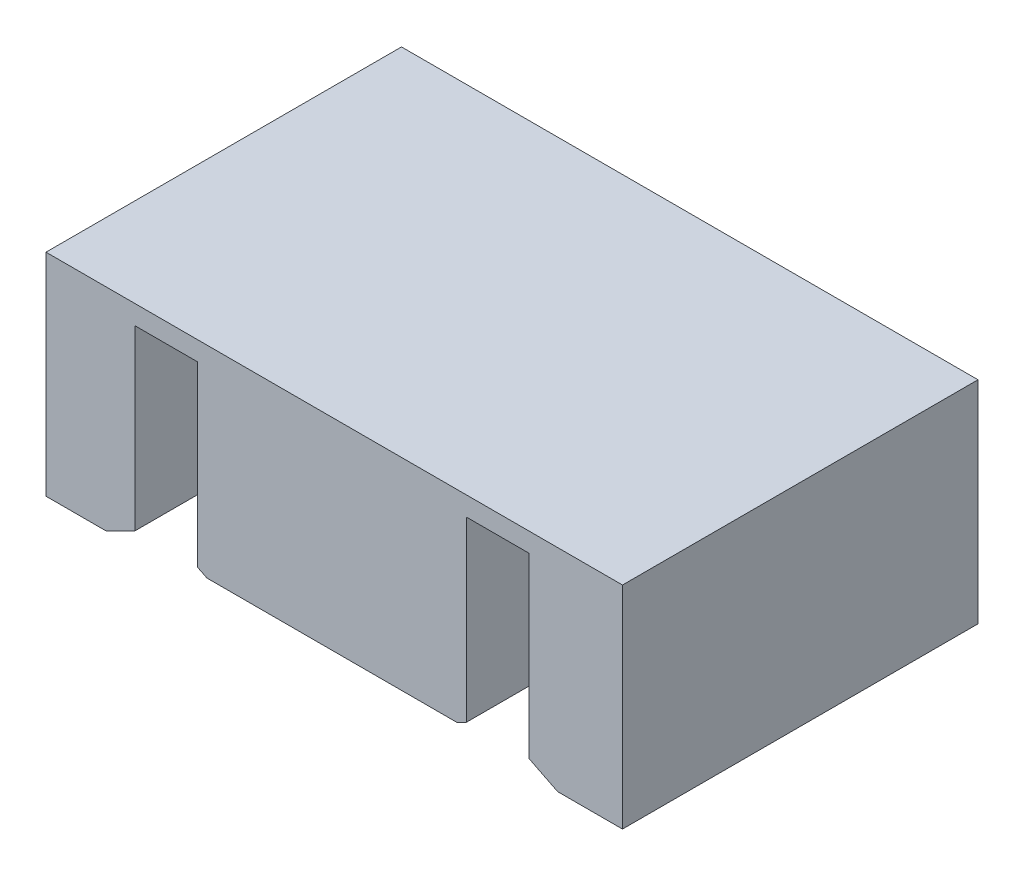
ISO-10303-21;
HEADER;
FILE_DESCRIPTION(('STEP AP214'),'2;1');
FILE_NAME('part.step','',(''),(''),'','','');
FILE_SCHEMA(('AUTOMOTIVE_DESIGN { 1 0 10303 214 1 1 1 1 }'));
ENDSEC;
DATA;
#1=APPLICATION_CONTEXT('core data for automotive mechanical design processes');
#2=APPLICATION_PROTOCOL_DEFINITION('international standard','automotive_design',2000,#1);
#3=PRODUCT_CONTEXT('',#1,'mechanical');
#4=PRODUCT('Part','Part','',(#3));
#5=PRODUCT_RELATED_PRODUCT_CATEGORY('part','',(#4));
#6=PRODUCT_DEFINITION_FORMATION('','',#4);
#7=PRODUCT_DEFINITION_CONTEXT('part definition',#1,'design');
#8=PRODUCT_DEFINITION('design','',#6,#7);
#9=PRODUCT_DEFINITION_SHAPE('','',#8);
#10=(LENGTH_UNIT() NAMED_UNIT(*) SI_UNIT(.MILLI.,.METRE.));
#11=(NAMED_UNIT(*) PLANE_ANGLE_UNIT() SI_UNIT($,.RADIAN.));
#12=(NAMED_UNIT(*) SI_UNIT($,.STERADIAN.) SOLID_ANGLE_UNIT());
#13=UNCERTAINTY_MEASURE_WITH_UNIT(LENGTH_MEASURE(1.E-05),#10,'distance_accuracy_value','');
#14=(GEOMETRIC_REPRESENTATION_CONTEXT(3) GLOBAL_UNCERTAINTY_ASSIGNED_CONTEXT((#13)) GLOBAL_UNIT_ASSIGNED_CONTEXT((#10,
#11,#12)) REPRESENTATION_CONTEXT('',''));
#15=CARTESIAN_POINT('',(0.,0.,0.));
#16=DIRECTION('',(0.,0.,1.));
#17=DIRECTION('',(1.,0.,0.));
#18=AXIS2_PLACEMENT_3D('',#15,#16,#17);
#19=CARTESIAN_POINT('',(0.,0.,0.));
#20=DIRECTION('',(0.,1.,0.));
#21=DIRECTION('',(0.,0.,1.));
#22=AXIS2_PLACEMENT_3D('',#19,#20,#21);
#23=PLANE('',#22);
#24=DIRECTION('',(1.,0.,0.));
#25=VECTOR('',#24,1.);
#26=CARTESIAN_POINT('',(-16.25,0.,-29.));
#27=LINE('',#26,#25);
#28=CARTESIAN_POINT('',(-16.25,0.,-29.));
#29=VERTEX_POINT('',#28);
#30=CARTESIAN_POINT('',(-6.74999999999997,0.,-29.));
#31=VERTEX_POINT('',#30);
#32=EDGE_CURVE('E400',#29,#31,#27,.T.);
#33=ORIENTED_EDGE('',*,*,#32,.F.);
#34=DIRECTION('',(0.,0.,1.));
#35=VECTOR('',#34,1.);
#36=CARTESIAN_POINT('',(-16.25,0.,-39.));
#37=LINE('',#36,#35);
#38=CARTESIAN_POINT('',(-16.25,0.,-35.));
#39=VERTEX_POINT('',#38);
#40=EDGE_CURVE('E304',#39,#29,#37,.T.);
#41=ORIENTED_EDGE('',*,*,#40,.F.);
#42=DIRECTION('',(-1.,0.,0.));
#43=VECTOR('',#42,1.);
#44=CARTESIAN_POINT('',(-11.5,0.,-35.));
#45=LINE('',#44,#43);
#46=CARTESIAN_POINT('',(-11.5,0.,-35.));
#47=VERTEX_POINT('',#46);
#48=EDGE_CURVE('E380',#47,#39,#45,.T.);
#49=ORIENTED_EDGE('',*,*,#48,.F.);
#50=DIRECTION('',(0.,0.,-1.));
#51=VECTOR('',#50,1.);
#52=CARTESIAN_POINT('',(-11.5,0.,-35.));
#53=LINE('',#52,#51);
#54=CARTESIAN_POINT('',(-11.5,0.,-45.));
#55=VERTEX_POINT('',#54);
#56=EDGE_CURVE('E390',#47,#55,#53,.T.);
#57=ORIENTED_EDGE('',*,*,#56,.T.);
#58=DIRECTION('',(-1.,0.,0.));
#59=VECTOR('',#58,1.);
#60=CARTESIAN_POINT('',(-60.,0.,-45.));
#61=LINE('',#60,#59);
#62=CARTESIAN_POINT('',(0.,0.,-45.));
#63=VERTEX_POINT('',#62);
#64=EDGE_CURVE('E431',#63,#55,#61,.T.);
#65=ORIENTED_EDGE('',*,*,#64,.F.);
#66=DIRECTION('',(0.,0.,-1.));
#67=VECTOR('',#66,1.);
#68=CARTESIAN_POINT('',(0.,0.,-45.));
#69=LINE('',#68,#67);
#70=CARTESIAN_POINT('',(0.,0.,-8.00000000000001));
#71=VERTEX_POINT('',#70);
#72=EDGE_CURVE('E427',#71,#63,#69,.T.);
#73=ORIENTED_EDGE('',*,*,#72,.F.);
#74=DIRECTION('',(-1.,0.,0.));
#75=VECTOR('',#74,1.);
#76=CARTESIAN_POINT('',(0.00100000000000794,0.,-8.00000000000001));
#77=LINE('',#76,#75);
#78=CARTESIAN_POINT('',(-6.74999999999997,0.,-8.00000000000001));
#79=VERTEX_POINT('',#78);
#80=EDGE_CURVE('E347',#71,#79,#77,.T.);
#81=ORIENTED_EDGE('',*,*,#80,.T.);
#82=DIRECTION('',(0.,0.,-1.));
#83=VECTOR('',#82,1.);
#84=CARTESIAN_POINT('',(-6.74999999999997,0.,0.));
#85=LINE('',#84,#83);
#86=EDGE_CURVE('E443',#79,#31,#85,.T.);
#87=ORIENTED_EDGE('',*,*,#86,.T.);
#88=EDGE_LOOP('',(#33,#41,#49,#57,#65,#73,#81,#87));
#89=FACE_BOUND('',#88,.T.);
#90=ADVANCED_FACE('F39',(#89),#23,.F.);
#91=CARTESIAN_POINT('',(-60.,30.,-45.));
#92=DIRECTION('',(1.,0.,0.));
#93=DIRECTION('',(0.,0.,-1.));
#94=AXIS2_PLACEMENT_3D('',#91,#92,#93);
#95=PLANE('',#94);
#96=DIRECTION('',(0.,0.,1.));
#97=VECTOR('',#96,1.);
#98=CARTESIAN_POINT('',(-60.,0.,-45.));
#99=LINE('',#98,#97);
#100=CARTESIAN_POINT('',(-60.,0.,-45.));
#101=VERTEX_POINT('',#100);
#102=CARTESIAN_POINT('',(-60.,0.,-8.));
#103=VERTEX_POINT('',#102);
#104=EDGE_CURVE('E419',#101,#103,#99,.T.);
#105=ORIENTED_EDGE('',*,*,#104,.T.);
#106=DIRECTION('',(0.,-1.,0.));
#107=VECTOR('',#106,1.);
#108=CARTESIAN_POINT('',(-60.,22.,-8.00000000000001));
#109=LINE('',#108,#107);
#110=CARTESIAN_POINT('',(-60.,22.,-8.00000000000001));
#111=VERTEX_POINT('',#110);
#112=EDGE_CURVE('E341',#111,#103,#109,.T.);
#113=ORIENTED_EDGE('',*,*,#112,.F.);
#114=DIRECTION('',(0.,0.,1.));
#115=VECTOR('',#114,1.);
#116=CARTESIAN_POINT('',(-60.,22.,-45.));
#117=LINE('',#116,#115);
#118=CARTESIAN_POINT('',(-60.,22.,-45.));
#119=VERTEX_POINT('',#118);
#120=EDGE_CURVE('E338',#119,#111,#117,.T.);
#121=ORIENTED_EDGE('',*,*,#120,.F.);
#122=DIRECTION('',(0.,-1.,0.));
#123=VECTOR('',#122,1.);
#124=CARTESIAN_POINT('',(-60.,30.,-45.));
#125=LINE('',#124,#123);
#126=EDGE_CURVE('E434',#119,#101,#125,.T.);
#127=ORIENTED_EDGE('',*,*,#126,.T.);
#128=EDGE_LOOP('',(#105,#113,#121,#127));
#129=FACE_BOUND('',#128,.T.);
#130=ADVANCED_FACE('F530',(#129),#95,.F.);
#131=CARTESIAN_POINT('',(0.,30.,-45.));
#132=DIRECTION('',(-1.,0.,0.));
#133=DIRECTION('',(0.,0.,1.));
#134=AXIS2_PLACEMENT_3D('',#131,#132,#133);
#135=PLANE('',#134);
#136=DIRECTION('',(0.,0.,-1.));
#137=VECTOR('',#136,1.);
#138=CARTESIAN_POINT('',(0.,22.,-45.));
#139=LINE('',#138,#137);
#140=CARTESIAN_POINT('',(0.,22.,-8.00000000000001));
#141=VERTEX_POINT('',#140);
#142=CARTESIAN_POINT('',(0.,22.,-45.));
#143=VERTEX_POINT('',#142);
#144=EDGE_CURVE('E351',#141,#143,#139,.T.);
#145=ORIENTED_EDGE('',*,*,#144,.F.);
#146=DIRECTION('',(0.,1.,0.));
#147=VECTOR('',#146,1.);
#148=CARTESIAN_POINT('',(0.,22.,-8.00000000000001));
#149=LINE('',#148,#147);
#150=EDGE_CURVE('E335',#71,#141,#149,.T.);
#151=ORIENTED_EDGE('',*,*,#150,.F.);
#152=ORIENTED_EDGE('',*,*,#72,.T.);
#153=DIRECTION('',(0.,-1.,0.));
#154=VECTOR('',#153,1.);
#155=CARTESIAN_POINT('',(0.,30.,-45.));
#156=LINE('',#155,#154);
#157=EDGE_CURVE('E436',#143,#63,#156,.T.);
#158=ORIENTED_EDGE('',*,*,#157,.F.);
#159=EDGE_LOOP('',(#145,#151,#152,#158));
#160=FACE_BOUND('',#159,.T.);
#161=ADVANCED_FACE('F522',(#160),#135,.F.);
#162=CARTESIAN_POINT('',(-60.,30.,-45.));
#163=DIRECTION('',(0.,0.,1.));
#164=DIRECTION('',(1.,0.,0.));
#165=AXIS2_PLACEMENT_3D('',#162,#163,#164);
#166=PLANE('',#165);
#167=ORIENTED_EDGE('',*,*,#126,.F.);
#168=DIRECTION('',(-1.,0.,0.));
#169=VECTOR('',#168,1.);
#170=CARTESIAN_POINT('',(0.001000000000001,22.,-45.));
#171=LINE('',#170,#169);
#172=EDGE_CURVE('E343',#143,#119,#171,.T.);
#173=ORIENTED_EDGE('',*,*,#172,.F.);
#174=ORIENTED_EDGE('',*,*,#157,.T.);
#175=ORIENTED_EDGE('',*,*,#64,.T.);
#176=CARTESIAN_POINT('',(-32.8331381050122,-5.37561332244758,-45.));
#177=DIRECTION('',(0.,0.,-1.));
#178=DIRECTION('',(-1.,0.,0.));
#179=AXIS2_PLACEMENT_3D('',#176,#177,#178);
#180=CIRCLE('',#179,22.);
#181=CARTESIAN_POINT('',(-46.230644896312,12.0745102237361,-45.));
#182=VERTEX_POINT('',#181);
#183=EDGE_CURVE('E377',#182,#55,#180,.T.);
#184=ORIENTED_EDGE('',*,*,#183,.F.);
#185=CARTESIAN_POINT('',(-44.0992233613325,9.29835420502508,-45.));
#186=DIRECTION('',(0.,0.,-1.));
#187=DIRECTION('',(-1.,0.,0.));
#188=AXIS2_PLACEMENT_3D('',#185,#186,#187);
#189=CIRCLE('',#188,3.5);
#190=CARTESIAN_POINT('',(-42.6119129602392,6.13008846951621,-45.));
#191=VERTEX_POINT('',#190);
#192=EDGE_CURVE('E395',#191,#182,#189,.T.);
#193=ORIENTED_EDGE('',*,*,#192,.F.);
#194=CARTESIAN_POINT('',(-38.183580329191,-3.30313712352215,-45.));
#195=DIRECTION('',(0.,0.,1.));
#196=DIRECTION('',(1.,0.,0.));
#197=AXIS2_PLACEMENT_3D('',#194,#195,#196);
#198=CIRCLE('',#197,10.4209344581165);
#199=CARTESIAN_POINT('',(-28.3,0.,-45.));
#200=VERTEX_POINT('',#199);
#201=EDGE_CURVE('E392',#200,#191,#198,.T.);
#202=ORIENTED_EDGE('',*,*,#201,.F.);
#203=EDGE_CURVE('E430',#200,#101,#61,.T.);
#204=ORIENTED_EDGE('',*,*,#203,.T.);
#205=EDGE_LOOP('',(#167,#173,#174,#175,#184,#193,#202,#204));
#206=FACE_BOUND('',#205,.T.);
#207=ADVANCED_FACE('F588',(#206),#166,.F.);
#208=DIRECTION('',(1.,0.,0.));
#209=VECTOR('',#208,1.);
#210=CARTESIAN_POINT('',(-44.25,0.,-39.));
#211=LINE('',#210,#209);
#212=CARTESIAN_POINT('',(-44.25,0.,-39.));
#213=VERTEX_POINT('',#212);
#214=CARTESIAN_POINT('',(-28.3,0.,-39.));
#215=VERTEX_POINT('',#214);
#216=EDGE_CURVE('E312',#213,#215,#211,.T.);
#217=ORIENTED_EDGE('',*,*,#216,.F.);
#218=DIRECTION('',(0.,0.,-1.));
#219=VECTOR('',#218,1.);
#220=CARTESIAN_POINT('',(-44.25,0.,-39.));
#221=LINE('',#220,#219);
#222=CARTESIAN_POINT('',(-44.25,0.,-29.));
#223=VERTEX_POINT('',#222);
#224=EDGE_CURVE('E283',#223,#213,#221,.T.);
#225=ORIENTED_EDGE('',*,*,#224,.F.);
#226=DIRECTION('',(1.,0.,0.));
#227=VECTOR('',#226,1.);
#228=CARTESIAN_POINT('',(-50.75,0.,-29.));
#229=LINE('',#228,#227);
#230=CARTESIAN_POINT('',(-53.75,0.,-29.));
#231=VERTEX_POINT('',#230);
#232=EDGE_CURVE('E410',#231,#223,#229,.T.);
#233=ORIENTED_EDGE('',*,*,#232,.F.);
#234=DIRECTION('',(0.,0.,1.));
#235=VECTOR('',#234,1.);
#236=CARTESIAN_POINT('',(-53.75,0.,0.));
#237=LINE('',#236,#235);
#238=CARTESIAN_POINT('',(-53.75,0.,-8.));
#239=VERTEX_POINT('',#238);
#240=EDGE_CURVE('E440',#231,#239,#237,.T.);
#241=ORIENTED_EDGE('',*,*,#240,.T.);
#242=EDGE_CURVE('E344',#239,#103,#77,.T.);
#243=ORIENTED_EDGE('',*,*,#242,.T.);
#244=ORIENTED_EDGE('',*,*,#104,.F.);
#245=ORIENTED_EDGE('',*,*,#203,.F.);
#246=DIRECTION('',(0.,0.,-1.));
#247=VECTOR('',#246,1.);
#248=CARTESIAN_POINT('',(-28.3,0.,-35.));
#249=LINE('',#248,#247);
#250=EDGE_CURVE('E403',#215,#200,#249,.T.);
#251=ORIENTED_EDGE('',*,*,#250,.F.);
#252=EDGE_LOOP('',(#217,#225,#233,#241,#243,#244,#245,#251));
#253=FACE_BOUND('',#252,.T.);
#254=ADVANCED_FACE('F536',(#253),#23,.F.);
#255=CARTESIAN_POINT('',(-16.25,20.,-7.));
#256=DIRECTION('',(-1.,0.,0.));
#257=DIRECTION('',(0.,0.,1.));
#258=AXIS2_PLACEMENT_3D('',#255,#256,#257);
#259=PLANE('',#258);
#260=DIRECTION('',(0.,0.,-1.));
#261=VECTOR('',#260,1.);
#262=CARTESIAN_POINT('',(-16.25,20.,-7.));
#263=LINE('',#262,#261);
#264=CARTESIAN_POINT('',(-16.25,20.,-8.00000000000001));
#265=VERTEX_POINT('',#264);
#266=CARTESIAN_POINT('',(-16.25,20.,-35.));
#267=VERTEX_POINT('',#266);
#268=EDGE_CURVE('E259',#265,#267,#263,.T.);
#269=ORIENTED_EDGE('',*,*,#268,.F.);
#270=DIRECTION('',(0.,1.,0.));
#271=VECTOR('',#270,1.);
#272=CARTESIAN_POINT('',(-16.25,22.,-8.00000000000001));
#273=LINE('',#272,#271);
#274=CARTESIAN_POINT('',(-16.25,1.50000000000001,-8.00000000000001));
#275=VERTEX_POINT('',#274);
#276=EDGE_CURVE('E372',#275,#265,#273,.T.);
#277=ORIENTED_EDGE('',*,*,#276,.F.);
#278=DIRECTION('',(0.,0.,-1.));
#279=VECTOR('',#278,1.);
#280=CARTESIAN_POINT('',(-16.25,1.50000000000001,-7.));
#281=LINE('',#280,#279);
#282=CARTESIAN_POINT('',(-16.25,1.50000000000001,-29.));
#283=VERTEX_POINT('',#282);
#284=EDGE_CURVE('E446',#275,#283,#281,.T.);
#285=ORIENTED_EDGE('',*,*,#284,.T.);
#286=DIRECTION('',(0.,-1.,0.));
#287=VECTOR('',#286,1.);
#288=CARTESIAN_POINT('',(-16.25,20.,-29.));
#289=LINE('',#288,#287);
#290=CARTESIAN_POINT('',(-16.25,10.,-29.));
#291=VERTEX_POINT('',#290);
#292=EDGE_CURVE('E258',#291,#283,#289,.T.);
#293=ORIENTED_EDGE('',*,*,#292,.F.);
#294=DIRECTION('',(0.,-0.707106781186549,0.707106781186546));
#295=VECTOR('',#294,1.);
#296=CARTESIAN_POINT('',(-16.25,4.00000000000002,-23.));
#297=LINE('',#296,#295);
#298=CARTESIAN_POINT('',(-16.25,12.,-31.));
#299=VERTEX_POINT('',#298);
#300=EDGE_CURVE('E491',#291,#299,#297,.F.);
#301=ORIENTED_EDGE('',*,*,#300,.T.);
#302=DIRECTION('',(0.,0.,1.));
#303=VECTOR('',#302,1.);
#304=CARTESIAN_POINT('',(-16.25,12.,-35.));
#305=LINE('',#304,#303);
#306=CARTESIAN_POINT('',(-16.25,12.,-35.));
#307=VERTEX_POINT('',#306);
#308=EDGE_CURVE('E280',#307,#299,#305,.T.);
#309=ORIENTED_EDGE('',*,*,#308,.F.);
#310=DIRECTION('',(0.,-1.,0.));
#311=VECTOR('',#310,1.);
#312=CARTESIAN_POINT('',(-16.25,20.,-35.));
#313=LINE('',#312,#311);
#314=EDGE_CURVE('E268',#267,#307,#313,.T.);
#315=ORIENTED_EDGE('',*,*,#314,.F.);
#316=EDGE_LOOP('',(#269,#277,#285,#293,#301,#309,#315));
#317=FACE_BOUND('',#316,.T.);
#318=ADVANCED_FACE('F495',(#317),#259,.F.);
#319=CARTESIAN_POINT('',(-9.75,20.,-7.));
#320=DIRECTION('',(1.,0.,0.));
#321=DIRECTION('',(0.,0.,-1.));
#322=AXIS2_PLACEMENT_3D('',#319,#320,#321);
#323=PLANE('',#322);
#324=DIRECTION('',(0.,0.,1.));
#325=VECTOR('',#324,1.);
#326=CARTESIAN_POINT('',(-9.75,1.50000000000001,-7.));
#327=LINE('',#326,#325);
#328=CARTESIAN_POINT('',(-9.75,1.50000000000001,-29.));
#329=VERTEX_POINT('',#328);
#330=CARTESIAN_POINT('',(-9.75,1.50000000000001,-8.00000000000001));
#331=VERTEX_POINT('',#330);
#332=EDGE_CURVE('E438',#329,#331,#327,.T.);
#333=ORIENTED_EDGE('',*,*,#332,.T.);
#334=DIRECTION('',(0.,-1.,0.));
#335=VECTOR('',#334,1.);
#336=CARTESIAN_POINT('',(-9.75,22.,-8.00000000000001));
#337=LINE('',#336,#335);
#338=CARTESIAN_POINT('',(-9.75,20.,-8.00000000000001));
#339=VERTEX_POINT('',#338);
#340=EDGE_CURVE('E255',#339,#331,#337,.T.);
#341=ORIENTED_EDGE('',*,*,#340,.F.);
#342=DIRECTION('',(0.,0.,1.));
#343=VECTOR('',#342,1.);
#344=CARTESIAN_POINT('',(-9.75,20.,-7.));
#345=LINE('',#344,#343);
#346=CARTESIAN_POINT('',(-9.75,20.,-35.));
#347=VERTEX_POINT('',#346);
#348=EDGE_CURVE('E247',#347,#339,#345,.T.);
#349=ORIENTED_EDGE('',*,*,#348,.F.);
#350=DIRECTION('',(0.,1.,0.));
#351=VECTOR('',#350,1.);
#352=CARTESIAN_POINT('',(-9.75,20.,-35.));
#353=LINE('',#352,#351);
#354=CARTESIAN_POINT('',(-9.75,12.,-35.));
#355=VERTEX_POINT('',#354);
#356=EDGE_CURVE('E253',#355,#347,#353,.T.);
#357=ORIENTED_EDGE('',*,*,#356,.F.);
#358=DIRECTION('',(0.,0.,1.));
#359=VECTOR('',#358,1.);
#360=CARTESIAN_POINT('',(-9.75,12.,-35.));
#361=LINE('',#360,#359);
#362=CARTESIAN_POINT('',(-9.75,12.,-31.));
#363=VERTEX_POINT('',#362);
#364=EDGE_CURVE('E281',#355,#363,#361,.T.);
#365=ORIENTED_EDGE('',*,*,#364,.T.);
#366=DIRECTION('',(0.,0.707106781186549,-0.707106781186546));
#367=VECTOR('',#366,1.);
#368=CARTESIAN_POINT('',(-9.75,4.00000000000002,-23.));
#369=LINE('',#368,#367);
#370=CARTESIAN_POINT('',(-9.75,10.,-29.));
#371=VERTEX_POINT('',#370);
#372=EDGE_CURVE('E489',#363,#371,#369,.F.);
#373=ORIENTED_EDGE('',*,*,#372,.T.);
#374=DIRECTION('',(0.,-1.,0.));
#375=VECTOR('',#374,1.);
#376=CARTESIAN_POINT('',(-9.75,20.,-29.));
#377=LINE('',#376,#375);
#378=EDGE_CURVE('E416',#371,#329,#377,.T.);
#379=ORIENTED_EDGE('',*,*,#378,.T.);
#380=EDGE_LOOP('',(#333,#341,#349,#357,#365,#373,#379));
#381=FACE_BOUND('',#380,.T.);
#382=ADVANCED_FACE('F250',(#381),#323,.F.);
#383=CARTESIAN_POINT('',(-16.25,20.,-29.));
#384=DIRECTION('',(0.,0.,-1.));
#385=DIRECTION('',(-1.,0.,0.));
#386=AXIS2_PLACEMENT_3D('',#383,#384,#385);
#387=PLANE('',#386);
#388=ORIENTED_EDGE('',*,*,#378,.F.);
#389=DIRECTION('',(-1.,0.,0.));
#390=VECTOR('',#389,1.);
#391=CARTESIAN_POINT('',(-16.25,10.,-29.));
#392=LINE('',#391,#390);
#393=EDGE_CURVE('E483',#371,#291,#392,.T.);
#394=ORIENTED_EDGE('',*,*,#393,.T.);
#395=ORIENTED_EDGE('',*,*,#292,.T.);
#396=DIRECTION('',(0.894427190999917,0.447213595499956,0.));
#397=VECTOR('',#396,1.);
#398=CARTESIAN_POINT('',(-8.85000000000002,5.19999999999998,-29.));
#399=LINE('',#398,#397);
#400=CARTESIAN_POINT('',(-17.25,1.,-29.));
#401=VERTEX_POINT('',#400);
#402=EDGE_CURVE('E458',#283,#401,#399,.F.);
#403=ORIENTED_EDGE('',*,*,#402,.T.);
#404=DIRECTION('',(1.,0.,0.));
#405=VECTOR('',#404,1.);
#406=CARTESIAN_POINT('',(-16.25,1.,-29.));
#407=LINE('',#406,#405);
#408=CARTESIAN_POINT('',(-16.25,1.,-29.));
#409=VERTEX_POINT('',#408);
#410=EDGE_CURVE('E324',#401,#409,#407,.T.);
#411=ORIENTED_EDGE('',*,*,#410,.T.);
#412=DIRECTION('',(0.,-1.,0.));
#413=VECTOR('',#412,1.);
#414=CARTESIAN_POINT('',(-16.25,20.,-29.));
#415=LINE('',#414,#413);
#416=EDGE_CURVE('E332',#409,#29,#415,.T.);
#417=ORIENTED_EDGE('',*,*,#416,.T.);
#418=ORIENTED_EDGE('',*,*,#32,.T.);
#419=DIRECTION('',(0.894427190999917,-0.447213595499956,0.));
#420=VECTOR('',#419,1.);
#421=CARTESIAN_POINT('',(-22.35,7.79999999999997,-29.));
#422=LINE('',#421,#420);
#423=EDGE_CURVE('E455',#31,#329,#422,.F.);
#424=ORIENTED_EDGE('',*,*,#423,.T.);
#425=EDGE_LOOP('',(#388,#394,#395,#403,#411,#417,#418,#424));
#426=FACE_BOUND('',#425,.T.);
#427=ADVANCED_FACE('F504',(#426),#387,.F.);
#428=CARTESIAN_POINT('',(0.,20.,0.));
#429=DIRECTION('',(0.,-1.,0.));
#430=DIRECTION('',(0.,0.,-1.));
#431=AXIS2_PLACEMENT_3D('',#428,#429,#430);
#432=PLANE('',#431);
#433=DIRECTION('',(-1.,0.,0.));
#434=VECTOR('',#433,1.);
#435=CARTESIAN_POINT('',(0.00100000000000794,20.,-8.00000000000001));
#436=LINE('',#435,#434);
#437=EDGE_CURVE('E370',#339,#265,#436,.T.);
#438=ORIENTED_EDGE('',*,*,#437,.T.);
#439=ORIENTED_EDGE('',*,*,#268,.T.);
#440=DIRECTION('',(-1.,0.,0.));
#441=VECTOR('',#440,1.);
#442=CARTESIAN_POINT('',(-9.75,20.,-35.));
#443=LINE('',#442,#441);
#444=EDGE_CURVE('E262',#347,#267,#443,.T.);
#445=ORIENTED_EDGE('',*,*,#444,.F.);
#446=ORIENTED_EDGE('',*,*,#348,.T.);
#447=EDGE_LOOP('',(#438,#439,#445,#446));
#448=FACE_BOUND('',#447,.T.);
#449=ADVANCED_FACE('F263',(#448),#432,.T.);
#450=CARTESIAN_POINT('',(-50.75,20.,-7.));
#451=DIRECTION('',(-1.,0.,0.));
#452=DIRECTION('',(0.,0.,1.));
#453=AXIS2_PLACEMENT_3D('',#450,#451,#452);
#454=PLANE('',#453);
#455=DIRECTION('',(0.,0.,-1.));
#456=VECTOR('',#455,1.);
#457=CARTESIAN_POINT('',(-50.75,20.,-7.));
#458=LINE('',#457,#456);
#459=CARTESIAN_POINT('',(-50.75,20.,-8.00000000000001));
#460=VERTEX_POINT('',#459);
#461=CARTESIAN_POINT('',(-50.75,20.,-35.));
#462=VERTEX_POINT('',#461);
#463=EDGE_CURVE('E407',#460,#462,#458,.T.);
#464=ORIENTED_EDGE('',*,*,#463,.F.);
#465=DIRECTION('',(0.,1.,0.));
#466=VECTOR('',#465,1.);
#467=CARTESIAN_POINT('',(-50.75,22.,-8.00000000000001));
#468=LINE('',#467,#466);
#469=CARTESIAN_POINT('',(-50.75,1.50000000000001,-8.));
#470=VERTEX_POINT('',#469);
#471=EDGE_CURVE('E356',#470,#460,#468,.T.);
#472=ORIENTED_EDGE('',*,*,#471,.F.);
#473=DIRECTION('',(0.,0.,-1.));
#474=VECTOR('',#473,1.);
#475=CARTESIAN_POINT('',(-50.75,1.50000000000001,-7.));
#476=LINE('',#475,#474);
#477=CARTESIAN_POINT('',(-50.75,1.50000000000001,-29.));
#478=VERTEX_POINT('',#477);
#479=EDGE_CURVE('E449',#470,#478,#476,.T.);
#480=ORIENTED_EDGE('',*,*,#479,.T.);
#481=DIRECTION('',(0.,-1.,0.));
#482=VECTOR('',#481,1.);
#483=CARTESIAN_POINT('',(-50.75,20.,-29.));
#484=LINE('',#483,#482);
#485=CARTESIAN_POINT('',(-50.75,9.99999999999999,-29.));
#486=VERTEX_POINT('',#485);
#487=EDGE_CURVE('E413',#486,#478,#484,.T.);
#488=ORIENTED_EDGE('',*,*,#487,.F.);
#489=DIRECTION('',(0.,-0.707106781186549,0.707106781186546));
#490=VECTOR('',#489,1.);
#491=CARTESIAN_POINT('',(-50.75,4.00000000000001,-23.0000000000001));
#492=LINE('',#491,#490);
#493=CARTESIAN_POINT('',(-50.75,12.,-31.));
#494=VERTEX_POINT('',#493);
#495=EDGE_CURVE('E11',#486,#494,#492,.F.);
#496=ORIENTED_EDGE('',*,*,#495,.T.);
#497=DIRECTION('',(0.,0.,1.));
#498=VECTOR('',#497,1.);
#499=CARTESIAN_POINT('',(-50.75,12.,-35.));
#500=LINE('',#499,#498);
#501=CARTESIAN_POINT('',(-50.75,12.,-35.));
#502=VERTEX_POINT('',#501);
#503=EDGE_CURVE('E275',#502,#494,#500,.T.);
#504=ORIENTED_EDGE('',*,*,#503,.F.);
#505=DIRECTION('',(0.,-1.,0.));
#506=VECTOR('',#505,1.);
#507=CARTESIAN_POINT('',(-50.75,20.,-35.));
#508=LINE('',#507,#506);
#509=EDGE_CURVE('E293',#462,#502,#508,.T.);
#510=ORIENTED_EDGE('',*,*,#509,.F.);
#511=EDGE_LOOP('',(#464,#472,#480,#488,#496,#504,#510));
#512=FACE_BOUND('',#511,.T.);
#513=ADVANCED_FACE('F546',(#512),#454,.F.);
#514=CARTESIAN_POINT('',(-44.25,20.,-7.));
#515=DIRECTION('',(1.,0.,0.));
#516=DIRECTION('',(0.,0.,-1.));
#517=AXIS2_PLACEMENT_3D('',#514,#515,#516);
#518=PLANE('',#517);
#519=DIRECTION('',(0.,0.,1.));
#520=VECTOR('',#519,1.);
#521=CARTESIAN_POINT('',(-44.25,1.50000000000001,-7.));
#522=LINE('',#521,#520);
#523=CARTESIAN_POINT('',(-44.25,1.50000000000001,-29.));
#524=VERTEX_POINT('',#523);
#525=CARTESIAN_POINT('',(-44.25,1.50000000000001,-8.));
#526=VERTEX_POINT('',#525);
#527=EDGE_CURVE('E452',#524,#526,#522,.T.);
#528=ORIENTED_EDGE('',*,*,#527,.T.);
#529=DIRECTION('',(0.,-1.,0.));
#530=VECTOR('',#529,1.);
#531=CARTESIAN_POINT('',(-44.25,22.,-8.00000000000001));
#532=LINE('',#531,#530);
#533=CARTESIAN_POINT('',(-44.25,20.,-8.00000000000001));
#534=VERTEX_POINT('',#533);
#535=EDGE_CURVE('E361',#534,#526,#532,.T.);
#536=ORIENTED_EDGE('',*,*,#535,.F.);
#537=DIRECTION('',(0.,0.,1.));
#538=VECTOR('',#537,1.);
#539=CARTESIAN_POINT('',(-44.25,20.,-7.));
#540=LINE('',#539,#538);
#541=CARTESIAN_POINT('',(-44.25,20.,-35.));
#542=VERTEX_POINT('',#541);
#543=EDGE_CURVE('E409',#542,#534,#540,.T.);
#544=ORIENTED_EDGE('',*,*,#543,.F.);
#545=DIRECTION('',(0.,1.,0.));
#546=VECTOR('',#545,1.);
#547=CARTESIAN_POINT('',(-44.25,20.,-35.));
#548=LINE('',#547,#546);
#549=CARTESIAN_POINT('',(-44.25,13.430110924993,-35.));
#550=VERTEX_POINT('',#549);
#551=EDGE_CURVE('E290',#550,#542,#548,.T.);
#552=ORIENTED_EDGE('',*,*,#551,.F.);
#553=CARTESIAN_POINT('',(-44.25,12.,-35.));
#554=VERTEX_POINT('',#553);
#555=EDGE_CURVE('E286',#554,#550,#548,.T.);
#556=ORIENTED_EDGE('',*,*,#555,.F.);
#557=DIRECTION('',(0.,0.,1.));
#558=VECTOR('',#557,1.);
#559=CARTESIAN_POINT('',(-44.25,12.,-35.));
#560=LINE('',#559,#558);
#561=CARTESIAN_POINT('',(-44.25,12.,-31.));
#562=VERTEX_POINT('',#561);
#563=EDGE_CURVE('E273',#554,#562,#560,.T.);
#564=ORIENTED_EDGE('',*,*,#563,.T.);
#565=DIRECTION('',(0.,0.707106781186549,-0.707106781186546));
#566=VECTOR('',#565,1.);
#567=CARTESIAN_POINT('',(-44.25,4.00000000000001,-23.0000000000001));
#568=LINE('',#567,#566);
#569=CARTESIAN_POINT('',(-44.25,9.99999999999999,-29.));
#570=VERTEX_POINT('',#569);
#571=EDGE_CURVE('E47',#562,#570,#568,.F.);
#572=ORIENTED_EDGE('',*,*,#571,.T.);
#573=DIRECTION('',(0.,-1.,0.));
#574=VECTOR('',#573,1.);
#575=CARTESIAN_POINT('',(-44.25,20.,-29.));
#576=LINE('',#575,#574);
#577=EDGE_CURVE('E417',#570,#524,#576,.T.);
#578=ORIENTED_EDGE('',*,*,#577,.T.);
#579=EDGE_LOOP('',(#528,#536,#544,#552,#556,#564,#572,#578));
#580=FACE_BOUND('',#579,.T.);
#581=ADVANCED_FACE('F555',(#580),#518,.F.);
#582=CARTESIAN_POINT('',(-50.75,20.,-29.));
#583=DIRECTION('',(0.,0.,-1.));
#584=DIRECTION('',(-1.,0.,0.));
#585=AXIS2_PLACEMENT_3D('',#582,#583,#584);
#586=PLANE('',#585);
#587=ORIENTED_EDGE('',*,*,#577,.F.);
#588=DIRECTION('',(-1.,0.,0.));
#589=VECTOR('',#588,1.);
#590=CARTESIAN_POINT('',(-50.75,9.99999999999999,-29.));
#591=LINE('',#590,#589);
#592=EDGE_CURVE('E54',#570,#486,#591,.T.);
#593=ORIENTED_EDGE('',*,*,#592,.T.);
#594=ORIENTED_EDGE('',*,*,#487,.T.);
#595=DIRECTION('',(0.894427190999917,0.447213595499956,0.));
#596=VECTOR('',#595,1.);
#597=CARTESIAN_POINT('',(-43.35,5.19999999999998,-29.));
#598=LINE('',#597,#596);
#599=EDGE_CURVE('E461',#478,#231,#598,.F.);
#600=ORIENTED_EDGE('',*,*,#599,.T.);
#601=ORIENTED_EDGE('',*,*,#232,.T.);
#602=DIRECTION('',(0.,1.,0.));
#603=VECTOR('',#602,1.);
#604=CARTESIAN_POINT('',(-44.25,20.,-29.));
#605=LINE('',#604,#603);
#606=CARTESIAN_POINT('',(-44.25,1.,-29.));
#607=VERTEX_POINT('',#606);
#608=EDGE_CURVE('E475',#223,#607,#605,.T.);
#609=ORIENTED_EDGE('',*,*,#608,.T.);
#610=DIRECTION('',(1.,0.,0.));
#611=VECTOR('',#610,1.);
#612=CARTESIAN_POINT('',(-50.75,1.,-29.));
#613=LINE('',#612,#611);
#614=CARTESIAN_POINT('',(-43.25,1.,-29.));
#615=VERTEX_POINT('',#614);
#616=EDGE_CURVE('E319',#607,#615,#613,.T.);
#617=ORIENTED_EDGE('',*,*,#616,.T.);
#618=DIRECTION('',(0.894427190999917,-0.447213595499956,0.));
#619=VECTOR('',#618,1.);
#620=CARTESIAN_POINT('',(-56.85,7.79999999999997,-29.));
#621=LINE('',#620,#619);
#622=EDGE_CURVE('E464',#615,#524,#621,.F.);
#623=ORIENTED_EDGE('',*,*,#622,.T.);
#624=EDGE_LOOP('',(#587,#593,#594,#600,#601,#609,#617,#623));
#625=FACE_BOUND('',#624,.T.);
#626=ADVANCED_FACE('F606',(#625),#586,.F.);
#627=CARTESIAN_POINT('',(0.,20.,0.));
#628=DIRECTION('',(0.,-1.,0.));
#629=DIRECTION('',(0.,0.,-1.));
#630=AXIS2_PLACEMENT_3D('',#627,#628,#629);
#631=PLANE('',#630);
#632=DIRECTION('',(-1.,0.,0.));
#633=VECTOR('',#632,1.);
#634=CARTESIAN_POINT('',(0.00100000000000794,20.,-8.00000000000001));
#635=LINE('',#634,#633);
#636=EDGE_CURVE('E358',#534,#460,#635,.T.);
#637=ORIENTED_EDGE('',*,*,#636,.T.);
#638=ORIENTED_EDGE('',*,*,#463,.T.);
#639=DIRECTION('',(-1.,0.,0.));
#640=VECTOR('',#639,1.);
#641=CARTESIAN_POINT('',(-44.25,20.,-35.));
#642=LINE('',#641,#640);
#643=EDGE_CURVE('E289',#542,#462,#642,.T.);
#644=ORIENTED_EDGE('',*,*,#643,.F.);
#645=ORIENTED_EDGE('',*,*,#543,.T.);
#646=EDGE_LOOP('',(#637,#638,#644,#645));
#647=FACE_BOUND('',#646,.T.);
#648=ADVANCED_FACE('F551',(#647),#631,.T.);
#649=CARTESIAN_POINT('',(-32.8331381050122,-5.37561332244758,-35.));
#650=DIRECTION('',(0.,0.,-1.));
#651=DIRECTION('',(-1.,0.,0.));
#652=AXIS2_PLACEMENT_3D('',#649,#650,#651);
#653=CYLINDRICAL_SURFACE('',#652,22.);
#654=ORIENTED_EDGE('',*,*,#183,.T.);
#655=ORIENTED_EDGE('',*,*,#56,.F.);
#656=CARTESIAN_POINT('',(-32.8331381050122,-5.37561332244758,-35.));
#657=DIRECTION('',(0.,0.,-1.));
#658=DIRECTION('',(-1.,0.,0.));
#659=AXIS2_PLACEMENT_3D('',#656,#657,#658);
#660=CIRCLE('',#659,22.);
#661=EDGE_CURVE('E381',#550,#47,#660,.T.);
#662=ORIENTED_EDGE('',*,*,#661,.F.);
#663=CARTESIAN_POINT('',(-46.230644896312,12.0745102237361,-35.));
#664=VERTEX_POINT('',#663);
#665=EDGE_CURVE('E378',#664,#550,#660,.T.);
#666=ORIENTED_EDGE('',*,*,#665,.F.);
#667=DIRECTION('',(0.,0.,-1.));
#668=VECTOR('',#667,1.);
#669=CARTESIAN_POINT('',(-46.230644896312,12.0745102237361,-35.));
#670=LINE('',#669,#668);
#671=EDGE_CURVE('E398',#664,#182,#670,.T.);
#672=ORIENTED_EDGE('',*,*,#671,.T.);
#673=EDGE_LOOP('',(#654,#655,#662,#666,#672));
#674=FACE_BOUND('',#673,.T.);
#675=ADVANCED_FACE('F563',(#674),#653,.F.);
#676=CARTESIAN_POINT('',(-44.0992233613325,9.29835420502508,-35.));
#677=DIRECTION('',(0.,0.,-1.));
#678=DIRECTION('',(-1.,0.,0.));
#679=AXIS2_PLACEMENT_3D('',#676,#677,#678);
#680=CYLINDRICAL_SURFACE('',#679,3.5);
#681=ORIENTED_EDGE('',*,*,#192,.T.);
#682=ORIENTED_EDGE('',*,*,#671,.F.);
#683=CARTESIAN_POINT('',(-44.0992233613325,9.29835420502508,-35.));
#684=DIRECTION('',(0.,0.,-1.));
#685=DIRECTION('',(-1.,0.,0.));
#686=AXIS2_PLACEMENT_3D('',#683,#684,#685);
#687=CIRCLE('',#686,3.5);
#688=CARTESIAN_POINT('',(-46.324332347089,12.,-35.));
#689=VERTEX_POINT('',#688);
#690=EDGE_CURVE('E386',#689,#664,#687,.T.);
#691=ORIENTED_EDGE('',*,*,#690,.F.);
#692=CARTESIAN_POINT('',(-42.6119129602392,6.13008846951621,-35.));
#693=VERTEX_POINT('',#692);
#694=EDGE_CURVE('E387',#693,#689,#687,.T.);
#695=ORIENTED_EDGE('',*,*,#694,.F.);
#696=DIRECTION('',(0.,0.,-1.));
#697=VECTOR('',#696,1.);
#698=CARTESIAN_POINT('',(-42.6119129602392,6.13008846951621,-35.));
#699=LINE('',#698,#697);
#700=EDGE_CURVE('E401',#693,#191,#699,.T.);
#701=ORIENTED_EDGE('',*,*,#700,.T.);
#702=EDGE_LOOP('',(#681,#682,#691,#695,#701));
#703=FACE_BOUND('',#702,.T.);
#704=ADVANCED_FACE('F578',(#703),#680,.F.);
#705=CARTESIAN_POINT('',(-38.183580329191,-3.30313712352215,-35.));
#706=DIRECTION('',(0.,0.,-1.));
#707=DIRECTION('',(-1.,0.,0.));
#708=AXIS2_PLACEMENT_3D('',#705,#706,#707);
#709=CYLINDRICAL_SURFACE('',#708,10.4209344581165);
#710=DIRECTION('',(0.,0.,-1.));
#711=VECTOR('',#710,1.);
#712=CARTESIAN_POINT('',(-28.6925906085914,1.,-35.));
#713=LINE('',#712,#711);
#714=CARTESIAN_POINT('',(-28.6925906085914,1.,-35.));
#715=VERTEX_POINT('',#714);
#716=CARTESIAN_POINT('',(-28.6925906085914,1.,-39.));
#717=VERTEX_POINT('',#716);
#718=EDGE_CURVE('E329',#715,#717,#713,.T.);
#719=ORIENTED_EDGE('',*,*,#718,.T.);
#720=CARTESIAN_POINT('',(-38.183580329191,-3.30313712352215,-39.));
#721=DIRECTION('',(0.,0.,-1.));
#722=DIRECTION('',(-1.,0.,0.));
#723=AXIS2_PLACEMENT_3D('',#720,#721,#722);
#724=CIRCLE('',#723,10.4209344581165);
#725=EDGE_CURVE('E472',#717,#215,#724,.T.);
#726=ORIENTED_EDGE('',*,*,#725,.T.);
#727=ORIENTED_EDGE('',*,*,#250,.T.);
#728=ORIENTED_EDGE('',*,*,#201,.T.);
#729=ORIENTED_EDGE('',*,*,#700,.F.);
#730=CARTESIAN_POINT('',(-38.183580329191,-3.30313712352215,-35.));
#731=DIRECTION('',(0.,0.,1.));
#732=DIRECTION('',(1.,0.,0.));
#733=AXIS2_PLACEMENT_3D('',#730,#731,#732);
#734=CIRCLE('',#733,10.4209344581165);
#735=EDGE_CURVE('E384',#715,#693,#734,.T.);
#736=ORIENTED_EDGE('',*,*,#735,.F.);
#737=EDGE_LOOP('',(#719,#726,#727,#728,#729,#736));
#738=FACE_BOUND('',#737,.T.);
#739=ADVANCED_FACE('F583',(#738),#709,.T.);
#740=CARTESIAN_POINT('',(-32.8331381050122,-5.37561332244758,-35.));
#741=DIRECTION('',(0.,0.,-1.));
#742=DIRECTION('',(-1.,0.,0.));
#743=AXIS2_PLACEMENT_3D('',#740,#741,#742);
#744=PLANE('',#743);
#745=ORIENTED_EDGE('',*,*,#555,.T.);
#746=ORIENTED_EDGE('',*,*,#661,.T.);
#747=ORIENTED_EDGE('',*,*,#48,.T.);
#748=DIRECTION('',(0.,-1.,0.));
#749=VECTOR('',#748,1.);
#750=CARTESIAN_POINT('',(-16.25,-5.37561332244758,-35.));
#751=LINE('',#750,#749);
#752=CARTESIAN_POINT('',(-16.25,1.,-35.));
#753=VERTEX_POINT('',#752);
#754=EDGE_CURVE('E470',#753,#39,#751,.T.);
#755=ORIENTED_EDGE('',*,*,#754,.F.);
#756=DIRECTION('',(1.,0.,0.));
#757=VECTOR('',#756,1.);
#758=CARTESIAN_POINT('',(-32.8331381050122,1.,-35.));
#759=LINE('',#758,#757);
#760=EDGE_CURVE('E327',#715,#753,#759,.T.);
#761=ORIENTED_EDGE('',*,*,#760,.F.);
#762=ORIENTED_EDGE('',*,*,#735,.T.);
#763=ORIENTED_EDGE('',*,*,#694,.T.);
#764=DIRECTION('',(-1.,0.,0.));
#765=VECTOR('',#764,1.);
#766=CARTESIAN_POINT('',(-32.8331381050122,12.,-35.));
#767=LINE('',#766,#765);
#768=EDGE_CURVE('E478',#554,#689,#767,.T.);
#769=ORIENTED_EDGE('',*,*,#768,.F.);
#770=EDGE_LOOP('',(#745,#746,#747,#755,#761,#762,#763,#769));
#771=FACE_BOUND('',#770,.T.);
#772=ADVANCED_FACE('F567',(#771),#744,.T.);
#773=CARTESIAN_POINT('',(-16.25,1.50000000000001,-7.));
#774=DIRECTION('',(-0.447213595499956,0.894427190999917,0.));
#775=DIRECTION('',(0.,0.,-1.));
#776=AXIS2_PLACEMENT_3D('',#773,#774,#775);
#777=PLANE('',#776);
#778=DIRECTION('',(0.,0.,-1.));
#779=VECTOR('',#778,1.);
#780=CARTESIAN_POINT('',(-17.25,1.,-7.));
#781=LINE('',#780,#779);
#782=CARTESIAN_POINT('',(-17.25,1.,-8.00000000000001));
#783=VERTEX_POINT('',#782);
#784=EDGE_CURVE('E322',#401,#783,#781,.F.);
#785=ORIENTED_EDGE('',*,*,#784,.F.);
#786=ORIENTED_EDGE('',*,*,#402,.F.);
#787=ORIENTED_EDGE('',*,*,#284,.F.);
#788=DIRECTION('',(0.894427190999917,0.447213595499956,0.));
#789=VECTOR('',#788,1.);
#790=CARTESIAN_POINT('',(4.9508,12.1004,-8.00000000000001));
#791=LINE('',#790,#789);
#792=EDGE_CURVE('E374',#275,#783,#791,.F.);
#793=ORIENTED_EDGE('',*,*,#792,.T.);
#794=EDGE_LOOP('',(#785,#786,#787,#793));
#795=FACE_BOUND('',#794,.T.);
#796=ADVANCED_FACE('F598',(#795),#777,.F.);
#797=CARTESIAN_POINT('',(-9.75,1.50000000000001,-7.));
#798=DIRECTION('',(0.447213595499956,0.894427190999917,0.));
#799=DIRECTION('',(0.,0.,1.));
#800=AXIS2_PLACEMENT_3D('',#797,#798,#799);
#801=PLANE('',#800);
#802=DIRECTION('',(0.894427190999917,-0.447213595499956,0.));
#803=VECTOR('',#802,1.);
#804=CARTESIAN_POINT('',(-10.1492,1.69959999999998,-8.00000000000001));
#805=LINE('',#804,#803);
#806=EDGE_CURVE('E366',#79,#331,#805,.F.);
#807=ORIENTED_EDGE('',*,*,#806,.T.);
#808=ORIENTED_EDGE('',*,*,#332,.F.);
#809=ORIENTED_EDGE('',*,*,#423,.F.);
#810=ORIENTED_EDGE('',*,*,#86,.F.);
#811=EDGE_LOOP('',(#807,#808,#809,#810));
#812=FACE_BOUND('',#811,.T.);
#813=ADVANCED_FACE('F510',(#812),#801,.F.);
#814=CARTESIAN_POINT('',(-44.25,1.50000000000001,-7.));
#815=DIRECTION('',(0.447213595499956,0.894427190999917,0.));
#816=DIRECTION('',(0.,0.,1.));
#817=AXIS2_PLACEMENT_3D('',#814,#815,#816);
#818=PLANE('',#817);
#819=DIRECTION('',(0.,0.,1.));
#820=VECTOR('',#819,1.);
#821=CARTESIAN_POINT('',(-43.25,1.,-7.));
#822=LINE('',#821,#820);
#823=CARTESIAN_POINT('',(-43.25,1.,-8.00000000000001));
#824=VERTEX_POINT('',#823);
#825=EDGE_CURVE('E317',#824,#615,#822,.F.);
#826=ORIENTED_EDGE('',*,*,#825,.F.);
#827=DIRECTION('',(0.894427190999917,-0.447213595499956,0.));
#828=VECTOR('',#827,1.);
#829=CARTESIAN_POINT('',(-17.0491999999999,-12.1004,-8.));
#830=LINE('',#829,#828);
#831=EDGE_CURVE('E364',#824,#526,#830,.F.);
#832=ORIENTED_EDGE('',*,*,#831,.T.);
#833=ORIENTED_EDGE('',*,*,#527,.F.);
#834=ORIENTED_EDGE('',*,*,#622,.F.);
#835=EDGE_LOOP('',(#826,#832,#833,#834));
#836=FACE_BOUND('',#835,.T.);
#837=ADVANCED_FACE('F604',(#836),#818,.F.);
#838=CARTESIAN_POINT('',(-50.75,1.50000000000001,-7.));
#839=DIRECTION('',(-0.447213595499956,0.894427190999917,0.));
#840=DIRECTION('',(0.,0.,-1.));
#841=AXIS2_PLACEMENT_3D('',#838,#839,#840);
#842=PLANE('',#841);
#843=DIRECTION('',(0.894427190999917,0.447213595499956,0.));
#844=VECTOR('',#843,1.);
#845=CARTESIAN_POINT('',(-1.94919999999994,25.9003999999999,-8.00000000000001));
#846=LINE('',#845,#844);
#847=EDGE_CURVE('E353',#470,#239,#846,.F.);
#848=ORIENTED_EDGE('',*,*,#847,.T.);
#849=ORIENTED_EDGE('',*,*,#240,.F.);
#850=ORIENTED_EDGE('',*,*,#599,.F.);
#851=ORIENTED_EDGE('',*,*,#479,.F.);
#852=EDGE_LOOP('',(#848,#849,#850,#851));
#853=FACE_BOUND('',#852,.T.);
#854=ADVANCED_FACE('F542',(#853),#842,.F.);
#855=CARTESIAN_POINT('',(0.00100000000000794,22.,-8.00000000000001));
#856=DIRECTION('',(0.,0.,-1.));
#857=DIRECTION('',(0.,1.,0.));
#858=AXIS2_PLACEMENT_3D('',#855,#856,#857);
#859=PLANE('',#858);
#860=ORIENTED_EDGE('',*,*,#831,.F.);
#861=DIRECTION('',(1.,0.,0.));
#862=VECTOR('',#861,1.);
#863=CARTESIAN_POINT('',(0.00100000000000794,1.,-8.00000000000001));
#864=LINE('',#863,#862);
#865=EDGE_CURVE('E467',#824,#783,#864,.T.);
#866=ORIENTED_EDGE('',*,*,#865,.T.);
#867=ORIENTED_EDGE('',*,*,#792,.F.);
#868=ORIENTED_EDGE('',*,*,#276,.T.);
#869=ORIENTED_EDGE('',*,*,#437,.F.);
#870=ORIENTED_EDGE('',*,*,#340,.T.);
#871=ORIENTED_EDGE('',*,*,#806,.F.);
#872=ORIENTED_EDGE('',*,*,#80,.F.);
#873=ORIENTED_EDGE('',*,*,#150,.T.);
#874=DIRECTION('',(-1.,0.,0.));
#875=VECTOR('',#874,1.);
#876=CARTESIAN_POINT('',(0.00100000000000794,22.,-8.00000000000001));
#877=LINE('',#876,#875);
#878=EDGE_CURVE('E348',#141,#111,#877,.T.);
#879=ORIENTED_EDGE('',*,*,#878,.T.);
#880=ORIENTED_EDGE('',*,*,#112,.T.);
#881=ORIENTED_EDGE('',*,*,#242,.F.);
#882=ORIENTED_EDGE('',*,*,#847,.F.);
#883=ORIENTED_EDGE('',*,*,#471,.T.);
#884=ORIENTED_EDGE('',*,*,#636,.F.);
#885=ORIENTED_EDGE('',*,*,#535,.T.);
#886=EDGE_LOOP('',(#860,#866,#867,#868,#869,#870,#871,#872,#873,#879,#880,#881,#882,#883,#884,#885));
#887=FACE_BOUND('',#886,.T.);
#888=ADVANCED_FACE('F514',(#887),#859,.F.);
#889=CARTESIAN_POINT('',(0.001000000000001,22.,-45.));
#890=DIRECTION('',(0.,-1.,0.));
#891=DIRECTION('',(0.,0.,-1.));
#892=AXIS2_PLACEMENT_3D('',#889,#890,#891);
#893=PLANE('',#892);
#894=ORIENTED_EDGE('',*,*,#144,.T.);
#895=ORIENTED_EDGE('',*,*,#172,.T.);
#896=ORIENTED_EDGE('',*,*,#120,.T.);
#897=ORIENTED_EDGE('',*,*,#878,.F.);
#898=EDGE_LOOP('',(#894,#895,#896,#897));
#899=FACE_BOUND('',#898,.T.);
#900=ADVANCED_FACE('F526',(#899),#893,.F.);
#901=CARTESIAN_POINT('',(-44.25,1.,-39.));
#902=DIRECTION('',(-1.,0.,0.));
#903=DIRECTION('',(0.,0.,1.));
#904=AXIS2_PLACEMENT_3D('',#901,#902,#903);
#905=PLANE('',#904);
#906=ORIENTED_EDGE('',*,*,#224,.T.);
#907=DIRECTION('',(0.,-1.,0.));
#908=VECTOR('',#907,1.);
#909=CARTESIAN_POINT('',(-44.25,1.,-39.));
#910=LINE('',#909,#908);
#911=CARTESIAN_POINT('',(-44.25,1.,-39.));
#912=VERTEX_POINT('',#911);
#913=EDGE_CURVE('E310',#912,#213,#910,.T.);
#914=ORIENTED_EDGE('',*,*,#913,.F.);
#915=DIRECTION('',(0.,0.,-1.));
#916=VECTOR('',#915,1.);
#917=CARTESIAN_POINT('',(-44.25,1.,-39.));
#918=LINE('',#917,#916);
#919=EDGE_CURVE('E301',#607,#912,#918,.T.);
#920=ORIENTED_EDGE('',*,*,#919,.F.);
#921=ORIENTED_EDGE('',*,*,#608,.F.);
#922=EDGE_LOOP('',(#906,#914,#920,#921));
#923=FACE_BOUND('',#922,.T.);
#924=ADVANCED_FACE('F610',(#923),#905,.F.);
#925=CARTESIAN_POINT('',(-44.25,1.,-39.));
#926=DIRECTION('',(0.,0.,-1.));
#927=DIRECTION('',(-1.,0.,0.));
#928=AXIS2_PLACEMENT_3D('',#925,#926,#927);
#929=PLANE('',#928);
#930=DIRECTION('',(1.,0.,0.));
#931=VECTOR('',#930,1.);
#932=CARTESIAN_POINT('',(-44.25,1.,-39.));
#933=LINE('',#932,#931);
#934=EDGE_CURVE('E303',#912,#717,#933,.T.);
#935=ORIENTED_EDGE('',*,*,#934,.F.);
#936=ORIENTED_EDGE('',*,*,#913,.T.);
#937=ORIENTED_EDGE('',*,*,#216,.T.);
#938=ORIENTED_EDGE('',*,*,#725,.F.);
#939=EDGE_LOOP('',(#935,#936,#937,#938));
#940=FACE_BOUND('',#939,.T.);
#941=ADVANCED_FACE('F614',(#940),#929,.F.);
#942=CARTESIAN_POINT('',(-16.25,1.,-39.));
#943=DIRECTION('',(1.,0.,0.));
#944=DIRECTION('',(0.,0.,-1.));
#945=AXIS2_PLACEMENT_3D('',#942,#943,#944);
#946=PLANE('',#945);
#947=DIRECTION('',(0.,0.,1.));
#948=VECTOR('',#947,1.);
#949=CARTESIAN_POINT('',(-16.25,1.,-39.));
#950=LINE('',#949,#948);
#951=EDGE_CURVE('E307',#753,#409,#950,.T.);
#952=ORIENTED_EDGE('',*,*,#951,.F.);
#953=ORIENTED_EDGE('',*,*,#754,.T.);
#954=ORIENTED_EDGE('',*,*,#40,.T.);
#955=ORIENTED_EDGE('',*,*,#416,.F.);
#956=EDGE_LOOP('',(#952,#953,#954,#955));
#957=FACE_BOUND('',#956,.T.);
#958=ADVANCED_FACE('F592',(#957),#946,.F.);
#959=CARTESIAN_POINT('',(0.,1.,0.));
#960=DIRECTION('',(0.,1.,0.));
#961=DIRECTION('',(0.,0.,1.));
#962=AXIS2_PLACEMENT_3D('',#959,#960,#961);
#963=PLANE('',#962);
#964=ORIENTED_EDGE('',*,*,#760,.T.);
#965=ORIENTED_EDGE('',*,*,#951,.T.);
#966=ORIENTED_EDGE('',*,*,#410,.F.);
#967=ORIENTED_EDGE('',*,*,#784,.T.);
#968=ORIENTED_EDGE('',*,*,#865,.F.);
#969=ORIENTED_EDGE('',*,*,#825,.T.);
#970=ORIENTED_EDGE('',*,*,#616,.F.);
#971=ORIENTED_EDGE('',*,*,#919,.T.);
#972=ORIENTED_EDGE('',*,*,#934,.T.);
#973=ORIENTED_EDGE('',*,*,#718,.F.);
#974=EDGE_LOOP('',(#964,#965,#966,#967,#968,#969,#970,#971,#972,#973));
#975=FACE_BOUND('',#974,.T.);
#976=ADVANCED_FACE('F596',(#975),#963,.F.);
#977=CARTESIAN_POINT('',(0.,0.,-35.));
#978=DIRECTION('',(0.,0.,-1.));
#979=DIRECTION('',(-1.,0.,0.));
#980=AXIS2_PLACEMENT_3D('',#977,#978,#979);
#981=PLANE('',#980);
#982=ORIENTED_EDGE('',*,*,#551,.T.);
#983=ORIENTED_EDGE('',*,*,#643,.T.);
#984=ORIENTED_EDGE('',*,*,#509,.T.);
#985=DIRECTION('',(1.,0.,0.));
#986=VECTOR('',#985,1.);
#987=CARTESIAN_POINT('',(-44.25,12.,-35.));
#988=LINE('',#987,#986);
#989=EDGE_CURVE('E296',#502,#689,#988,.T.);
#990=ORIENTED_EDGE('',*,*,#989,.T.);
#991=ORIENTED_EDGE('',*,*,#690,.T.);
#992=ORIENTED_EDGE('',*,*,#665,.T.);
#993=EDGE_LOOP('',(#982,#983,#984,#990,#991,#992));
#994=FACE_BOUND('',#993,.T.);
#995=ADVANCED_FACE('F557',(#994),#981,.F.);
#996=CARTESIAN_POINT('',(-44.25,12.,-35.));
#997=DIRECTION('',(0.,-1.,0.));
#998=DIRECTION('',(1.,0.,0.));
#999=AXIS2_PLACEMENT_3D('',#996,#997,#998);
#1000=PLANE('',#999);
#1001=ORIENTED_EDGE('',*,*,#503,.T.);
#1002=DIRECTION('',(1.,0.,0.));
#1003=VECTOR('',#1002,1.);
#1004=CARTESIAN_POINT('',(-44.25,12.,-31.));
#1005=LINE('',#1004,#1003);
#1006=EDGE_CURVE('E485',#494,#562,#1005,.T.);
#1007=ORIENTED_EDGE('',*,*,#1006,.T.);
#1008=ORIENTED_EDGE('',*,*,#563,.F.);
#1009=ORIENTED_EDGE('',*,*,#768,.T.);
#1010=ORIENTED_EDGE('',*,*,#989,.F.);
#1011=EDGE_LOOP('',(#1001,#1007,#1008,#1009,#1010));
#1012=FACE_BOUND('',#1011,.T.);
#1013=ADVANCED_FACE('F572',(#1012),#1000,.F.);
#1014=CARTESIAN_POINT('',(-9.75,12.,-35.));
#1015=DIRECTION('',(0.,-1.,0.));
#1016=DIRECTION('',(0.,0.,-1.));
#1017=AXIS2_PLACEMENT_3D('',#1014,#1015,#1016);
#1018=PLANE('',#1017);
#1019=ORIENTED_EDGE('',*,*,#308,.T.);
#1020=DIRECTION('',(1.,0.,0.));
#1021=VECTOR('',#1020,1.);
#1022=CARTESIAN_POINT('',(-9.75,12.,-31.));
#1023=LINE('',#1022,#1021);
#1024=EDGE_CURVE('E480',#299,#363,#1023,.T.);
#1025=ORIENTED_EDGE('',*,*,#1024,.T.);
#1026=ORIENTED_EDGE('',*,*,#364,.F.);
#1027=DIRECTION('',(1.,0.,0.));
#1028=VECTOR('',#1027,1.);
#1029=CARTESIAN_POINT('',(-9.75,12.,-35.));
#1030=LINE('',#1029,#1028);
#1031=EDGE_CURVE('E272',#307,#355,#1030,.T.);
#1032=ORIENTED_EDGE('',*,*,#1031,.F.);
#1033=EDGE_LOOP('',(#1019,#1025,#1026,#1032));
#1034=FACE_BOUND('',#1033,.T.);
#1035=ADVANCED_FACE('F500',(#1034),#1018,.F.);
#1036=CARTESIAN_POINT('',(0.,0.,-35.));
#1037=DIRECTION('',(0.,0.,-1.));
#1038=DIRECTION('',(-1.,0.,0.));
#1039=AXIS2_PLACEMENT_3D('',#1036,#1037,#1038);
#1040=PLANE('',#1039);
#1041=ORIENTED_EDGE('',*,*,#356,.T.);
#1042=ORIENTED_EDGE('',*,*,#444,.T.);
#1043=ORIENTED_EDGE('',*,*,#314,.T.);
#1044=ORIENTED_EDGE('',*,*,#1031,.T.);
#1045=EDGE_LOOP('',(#1041,#1042,#1043,#1044));
#1046=FACE_BOUND('',#1045,.T.);
#1047=ADVANCED_FACE('F270',(#1046),#1040,.F.);
#1048=CARTESIAN_POINT('',(-9.75,12.,-31.));
#1049=DIRECTION('',(0.,-0.707106781186546,-0.707106781186549));
#1050=DIRECTION('',(1.,0.,0.));
#1051=AXIS2_PLACEMENT_3D('',#1048,#1049,#1050);
#1052=PLANE('',#1051);
#1053=ORIENTED_EDGE('',*,*,#300,.F.);
#1054=ORIENTED_EDGE('',*,*,#393,.F.);
#1055=ORIENTED_EDGE('',*,*,#372,.F.);
#1056=ORIENTED_EDGE('',*,*,#1024,.F.);
#1057=EDGE_LOOP('',(#1053,#1054,#1055,#1056));
#1058=FACE_BOUND('',#1057,.T.);
#1059=ADVANCED_FACE('F501',(#1058),#1052,.F.);
#1060=CARTESIAN_POINT('',(-44.25,12.,-31.));
#1061=DIRECTION('',(0.,-0.707106781186546,-0.707106781186549));
#1062=DIRECTION('',(1.,0.,0.));
#1063=AXIS2_PLACEMENT_3D('',#1060,#1061,#1062);
#1064=PLANE('',#1063);
#1065=ORIENTED_EDGE('',*,*,#495,.F.);
#1066=ORIENTED_EDGE('',*,*,#592,.F.);
#1067=ORIENTED_EDGE('',*,*,#571,.F.);
#1068=ORIENTED_EDGE('',*,*,#1006,.F.);
#1069=EDGE_LOOP('',(#1065,#1066,#1067,#1068));
#1070=FACE_BOUND('',#1069,.T.);
#1071=ADVANCED_FACE('F41',(#1070),#1064,.F.);
#1072=CLOSED_SHELL('',(#90,#130,#161,#207,#254,#318,#382,#427,#449,#513,#581,#626,#648,#675,
#704,#739,#772,#796,#813,#837,#854,#888,#900,#924,#941,#958,#976,#995,#1013,#1035,#1047,#1059,#1071));
#1073=MANIFOLD_SOLID_BREP('B2',#1072);
#1074=ADVANCED_BREP_SHAPE_REPRESENTATION('',(#18,#1073),#14);
#1075=SHAPE_DEFINITION_REPRESENTATION(#9,#1074);
ENDSEC;
END-ISO-10303-21;
